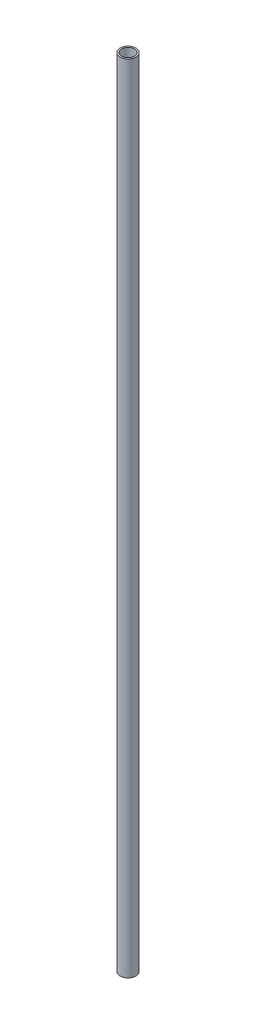
ISO-10303-21;
HEADER;
FILE_DESCRIPTION(('STEP AP214'),'2;1');
FILE_NAME('part.step','',(''),(''),'','','');
FILE_SCHEMA(('AUTOMOTIVE_DESIGN { 1 0 10303 214 1 1 1 1 }'));
ENDSEC;
DATA;
#1=APPLICATION_CONTEXT('core data for automotive mechanical design processes');
#2=APPLICATION_PROTOCOL_DEFINITION('international standard','automotive_design',2000,#1);
#3=PRODUCT_CONTEXT('',#1,'mechanical');
#4=PRODUCT('Part','Part','',(#3));
#5=PRODUCT_RELATED_PRODUCT_CATEGORY('part','',(#4));
#6=PRODUCT_DEFINITION_FORMATION('','',#4);
#7=PRODUCT_DEFINITION_CONTEXT('part definition',#1,'design');
#8=PRODUCT_DEFINITION('design','',#6,#7);
#9=PRODUCT_DEFINITION_SHAPE('','',#8);
#10=(LENGTH_UNIT() NAMED_UNIT(*) SI_UNIT(.MILLI.,.METRE.));
#11=(NAMED_UNIT(*) PLANE_ANGLE_UNIT() SI_UNIT($,.RADIAN.));
#12=(NAMED_UNIT(*) SI_UNIT($,.STERADIAN.) SOLID_ANGLE_UNIT());
#13=UNCERTAINTY_MEASURE_WITH_UNIT(LENGTH_MEASURE(1.E-05),#10,'distance_accuracy_value','');
#14=(GEOMETRIC_REPRESENTATION_CONTEXT(3) GLOBAL_UNCERTAINTY_ASSIGNED_CONTEXT((#13)) GLOBAL_UNIT_ASSIGNED_CONTEXT((#10,
#11,#12)) REPRESENTATION_CONTEXT('',''));
#15=CARTESIAN_POINT('',(0.,0.,0.));
#16=DIRECTION('',(0.,0.,1.));
#17=DIRECTION('',(1.,0.,0.));
#18=AXIS2_PLACEMENT_3D('',#15,#16,#17);
#19=CARTESIAN_POINT('',(0.,250.,0.));
#20=DIRECTION('',(0.,1.,0.));
#21=DIRECTION('',(0.,0.,1.));
#22=AXIS2_PLACEMENT_3D('',#19,#20,#21);
#23=PLANE('',#22);
#24=CARTESIAN_POINT('',(0.,250.,0.));
#25=DIRECTION('',(0.,1.,0.));
#26=DIRECTION('',(0.,0.,1.));
#27=AXIS2_PLACEMENT_3D('',#24,#25,#26);
#28=CIRCLE('',#27,2.5);
#29=CARTESIAN_POINT('',(0.,250.,2.5));
#30=VERTEX_POINT('',#29);
#31=EDGE_CURVE('E10',#30,#30,#28,.T.);
#32=ORIENTED_EDGE('',*,*,#31,.T.);
#33=EDGE_LOOP('',(#32));
#34=FACE_BOUND('',#33,.T.);
#35=CARTESIAN_POINT('',(0.,250.,0.));
#36=DIRECTION('',(0.,1.,0.));
#37=DIRECTION('',(0.,0.,1.));
#38=AXIS2_PLACEMENT_3D('',#35,#36,#37);
#39=CIRCLE('',#38,2.);
#40=CARTESIAN_POINT('',(0.,250.,2.));
#41=VERTEX_POINT('',#40);
#42=EDGE_CURVE('E56',#41,#41,#39,.T.);
#43=ORIENTED_EDGE('',*,*,#42,.F.);
#44=EDGE_LOOP('',(#43));
#45=FACE_BOUND('',#44,.T.);
#46=ADVANCED_FACE('F43',(#34,#45),#23,.T.);
#47=CARTESIAN_POINT('',(0.,0.,0.));
#48=DIRECTION('',(0.,1.,0.));
#49=DIRECTION('',(0.,0.,1.));
#50=AXIS2_PLACEMENT_3D('',#47,#48,#49);
#51=PLANE('',#50);
#52=CARTESIAN_POINT('',(0.,0.,0.));
#53=DIRECTION('',(0.,1.,0.));
#54=DIRECTION('',(0.,0.,1.));
#55=AXIS2_PLACEMENT_3D('',#52,#53,#54);
#56=CIRCLE('',#55,2.5);
#57=CARTESIAN_POINT('',(0.,0.,2.5));
#58=VERTEX_POINT('',#57);
#59=EDGE_CURVE('E47',#58,#58,#56,.T.);
#60=ORIENTED_EDGE('',*,*,#59,.F.);
#61=EDGE_LOOP('',(#60));
#62=FACE_BOUND('',#61,.T.);
#63=CARTESIAN_POINT('',(0.,0.,0.));
#64=DIRECTION('',(0.,1.,0.));
#65=DIRECTION('',(0.,0.,1.));
#66=AXIS2_PLACEMENT_3D('',#63,#64,#65);
#67=CIRCLE('',#66,2.);
#68=CARTESIAN_POINT('',(0.,0.,2.));
#69=VERTEX_POINT('',#68);
#70=EDGE_CURVE('E58',#69,#69,#67,.T.);
#71=ORIENTED_EDGE('',*,*,#70,.T.);
#72=EDGE_LOOP('',(#71));
#73=FACE_BOUND('',#72,.T.);
#74=ADVANCED_FACE('F70',(#62,#73),#51,.F.);
#75=CARTESIAN_POINT('',(0.,250.,0.));
#76=DIRECTION('',(0.,-1.,0.));
#77=DIRECTION('',(0.,0.,-1.));
#78=AXIS2_PLACEMENT_3D('',#75,#76,#77);
#79=CYLINDRICAL_SURFACE('',#78,2.5);
#80=ORIENTED_EDGE('',*,*,#31,.F.);
#81=EDGE_LOOP('',(#80));
#82=FACE_BOUND('',#81,.T.);
#83=ORIENTED_EDGE('',*,*,#59,.T.);
#84=EDGE_LOOP('',(#83));
#85=FACE_BOUND('',#84,.T.);
#86=ADVANCED_FACE('F45',(#82,#85),#79,.T.);
#87=CARTESIAN_POINT('',(0.,250.,0.));
#88=DIRECTION('',(0.,-1.,0.));
#89=DIRECTION('',(0.,0.,-1.));
#90=AXIS2_PLACEMENT_3D('',#87,#88,#89);
#91=CYLINDRICAL_SURFACE('',#90,2.);
#92=ORIENTED_EDGE('',*,*,#42,.T.);
#93=EDGE_LOOP('',(#92));
#94=FACE_BOUND('',#93,.T.);
#95=ORIENTED_EDGE('',*,*,#70,.F.);
#96=EDGE_LOOP('',(#95));
#97=FACE_BOUND('',#96,.T.);
#98=ADVANCED_FACE('F66',(#94,#97),#91,.F.);
#99=CLOSED_SHELL('',(#46,#74,#86,#98));
#100=MANIFOLD_SOLID_BREP('B2',#99);
#101=ADVANCED_BREP_SHAPE_REPRESENTATION('',(#18,#100),#14);
#102=SHAPE_DEFINITION_REPRESENTATION(#9,#101);
ENDSEC;
END-ISO-10303-21;
